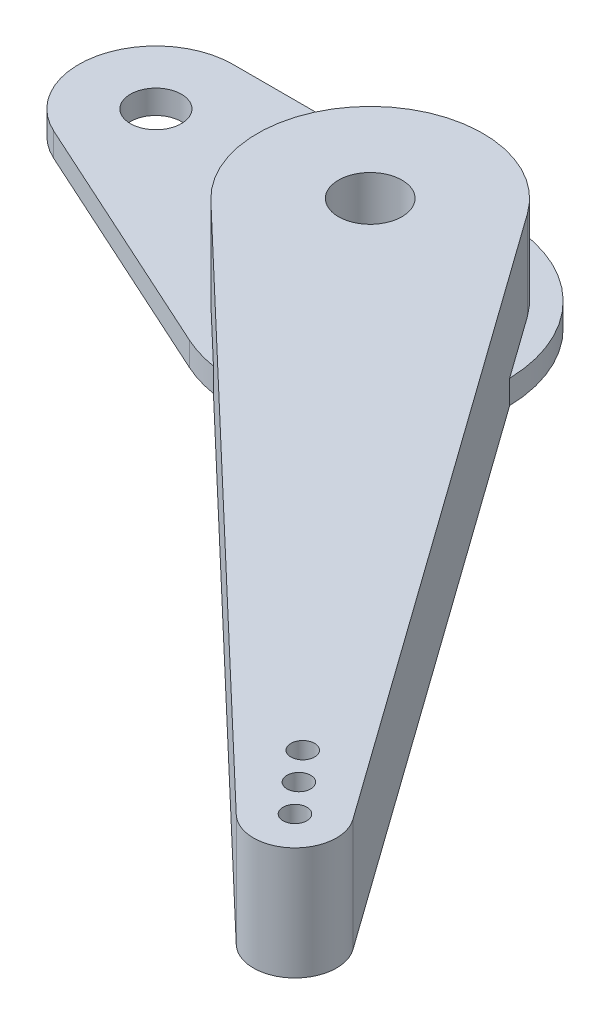
ISO-10303-21;
HEADER;
FILE_DESCRIPTION(('STEP AP214'),'2;1');
FILE_NAME('part.step','',(''),(''),'','','');
FILE_SCHEMA(('AUTOMOTIVE_DESIGN { 1 0 10303 214 1 1 1 1 }'));
ENDSEC;
DATA;
#1=APPLICATION_CONTEXT('core data for automotive mechanical design processes');
#2=APPLICATION_PROTOCOL_DEFINITION('international standard','automotive_design',2000,#1);
#3=PRODUCT_CONTEXT('',#1,'mechanical');
#4=PRODUCT('Part','Part','',(#3));
#5=PRODUCT_RELATED_PRODUCT_CATEGORY('part','',(#4));
#6=PRODUCT_DEFINITION_FORMATION('','',#4);
#7=PRODUCT_DEFINITION_CONTEXT('part definition',#1,'design');
#8=PRODUCT_DEFINITION('design','',#6,#7);
#9=PRODUCT_DEFINITION_SHAPE('','',#8);
#10=(LENGTH_UNIT() NAMED_UNIT(*) SI_UNIT(.MILLI.,.METRE.));
#11=(NAMED_UNIT(*) PLANE_ANGLE_UNIT() SI_UNIT($,.RADIAN.));
#12=(NAMED_UNIT(*) SI_UNIT($,.STERADIAN.) SOLID_ANGLE_UNIT());
#13=UNCERTAINTY_MEASURE_WITH_UNIT(LENGTH_MEASURE(1.E-05),#10,'distance_accuracy_value','');
#14=(GEOMETRIC_REPRESENTATION_CONTEXT(3) GLOBAL_UNCERTAINTY_ASSIGNED_CONTEXT((#13)) GLOBAL_UNIT_ASSIGNED_CONTEXT((#10,
#11,#12)) REPRESENTATION_CONTEXT('',''));
#15=CARTESIAN_POINT('',(0.,0.,0.));
#16=DIRECTION('',(0.,0.,1.));
#17=DIRECTION('',(1.,0.,0.));
#18=AXIS2_PLACEMENT_3D('',#15,#16,#17);
#19=CARTESIAN_POINT('',(0.,2.,0.));
#20=DIRECTION('',(0.,-1.,0.));
#21=DIRECTION('',(0.,0.,-1.));
#22=AXIS2_PLACEMENT_3D('',#19,#20,#21);
#23=CYLINDRICAL_SURFACE('',#22,11.5);
#24=CARTESIAN_POINT('',(0.,2.,0.));
#25=DIRECTION('',(0.,1.,0.));
#26=DIRECTION('',(0.,0.,1.));
#27=AXIS2_PLACEMENT_3D('',#24,#25,#26);
#28=CIRCLE('',#27,11.5);
#29=CARTESIAN_POINT('',(11.4972327717699,2.,-0.252266905754932));
#30=VERTEX_POINT('',#29);
#31=CARTESIAN_POINT('',(0.,2.,-11.5));
#32=VERTEX_POINT('',#31);
#33=EDGE_CURVE('E180',#30,#32,#28,.T.);
#34=ORIENTED_EDGE('',*,*,#33,.F.);
#35=DIRECTION('',(0.,-1.,0.));
#36=VECTOR('',#35,1.);
#37=CARTESIAN_POINT('',(11.4972327717699,2.,-0.252266905754932));
#38=LINE('',#37,#36);
#39=CARTESIAN_POINT('',(11.4972327717699,0.,-0.252266905754929));
#40=VERTEX_POINT('',#39);
#41=EDGE_CURVE('E11',#30,#40,#38,.T.);
#42=ORIENTED_EDGE('',*,*,#41,.T.);
#43=CARTESIAN_POINT('',(0.,0.,0.));
#44=DIRECTION('',(0.,1.,0.));
#45=DIRECTION('',(0.,0.,1.));
#46=AXIS2_PLACEMENT_3D('',#43,#44,#45);
#47=CIRCLE('',#46,11.5);
#48=CARTESIAN_POINT('',(0.,0.,-11.5));
#49=VERTEX_POINT('',#48);
#50=EDGE_CURVE('E176',#40,#49,#47,.T.);
#51=ORIENTED_EDGE('',*,*,#50,.T.);
#52=DIRECTION('',(0.,-1.,0.));
#53=VECTOR('',#52,1.);
#54=CARTESIAN_POINT('',(0.,2.,-11.5));
#55=LINE('',#54,#53);
#56=EDGE_CURVE('E203',#32,#49,#55,.T.);
#57=ORIENTED_EDGE('',*,*,#56,.F.);
#58=EDGE_LOOP('',(#34,#42,#51,#57));
#59=FACE_BOUND('',#58,.T.);
#60=ADVANCED_FACE('F33',(#59),#23,.T.);
#61=CARTESIAN_POINT('',(0.,2.,0.));
#62=DIRECTION('',(0.,1.,0.));
#63=DIRECTION('',(0.,0.,1.));
#64=AXIS2_PLACEMENT_3D('',#61,#62,#63);
#65=PLANE('',#64);
#66=DIRECTION('',(-0.581528317185255,0.,-0.813526162032719));
#67=VECTOR('',#66,1.);
#68=CARTESIAN_POINT('',(7.72849853931083,2.,-5.52451901325992));
#69=LINE('',#68,#67);
#70=CARTESIAN_POINT('',(7.72849853931083,2.,-5.52451901325992));
#71=VERTEX_POINT('',#70);
#72=EDGE_CURVE('E164',#30,#71,#69,.T.);
#73=ORIENTED_EDGE('',*,*,#72,.F.);
#74=ORIENTED_EDGE('',*,*,#33,.T.);
#75=DIRECTION('',(-1.,0.,0.));
#76=VECTOR('',#75,1.);
#77=CARTESIAN_POINT('',(0.,2.,-11.5));
#78=LINE('',#77,#76);
#79=CARTESIAN_POINT('',(-23.0642580630724,2.,-11.5));
#80=VERTEX_POINT('',#79);
#81=EDGE_CURVE('E179',#32,#80,#78,.T.);
#82=ORIENTED_EDGE('',*,*,#81,.T.);
#83=CARTESIAN_POINT('',(-23.0642580630724,2.,-5.));
#84=DIRECTION('',(0.,1.,0.));
#85=DIRECTION('',(0.,0.,1.));
#86=AXIS2_PLACEMENT_3D('',#83,#84,#85);
#87=CIRCLE('',#86,6.5);
#88=CARTESIAN_POINT('',(-25.7559716046188,2.,0.916475150818731));
#89=VERTEX_POINT('',#88);
#90=EDGE_CURVE('E182',#80,#89,#87,.T.);
#91=ORIENTED_EDGE('',*,*,#90,.T.);
#92=DIRECTION('',(0.910226946279805,0.,0.414109775622529));
#93=VECTOR('',#92,1.);
#94=CARTESIAN_POINT('',(-25.7559716046188,2.,0.91647515081873));
#95=LINE('',#94,#93);
#96=CARTESIAN_POINT('',(-4.76226241965909,2.,10.4676098822178));
#97=VERTEX_POINT('',#96);
#98=EDGE_CURVE('E184',#89,#97,#95,.T.);
#99=ORIENTED_EDGE('',*,*,#98,.T.);
#100=CARTESIAN_POINT('',(-1.86448246155958,2.,11.347850243572));
#101=VERTEX_POINT('',#100);
#102=EDGE_CURVE('E177',#97,#101,#28,.T.);
#103=ORIENTED_EDGE('',*,*,#102,.T.);
#104=DIRECTION('',(0.72379092585132,0.,0.690019344406582));
#105=VECTOR('',#104,1.);
#106=CARTESIAN_POINT('',(-6.55518377186253,2.,6.87601379558754));
#107=LINE('',#106,#105);
#108=CARTESIAN_POINT('',(-6.55518377186253,2.,6.87601379558754));
#109=VERTEX_POINT('',#108);
#110=EDGE_CURVE('E53',#109,#101,#107,.T.);
#111=ORIENTED_EDGE('',*,*,#110,.F.);
#112=CARTESIAN_POINT('',(0.,2.,0.));
#113=DIRECTION('',(0.,1.,0.));
#114=DIRECTION('',(0.,0.,1.));
#115=AXIS2_PLACEMENT_3D('',#112,#113,#114);
#116=CIRCLE('',#115,9.5);
#117=EDGE_CURVE('E48',#71,#109,#116,.T.);
#118=ORIENTED_EDGE('',*,*,#117,.F.);
#119=EDGE_LOOP('',(#73,#74,#82,#91,#99,#103,#111,#118));
#120=FACE_BOUND('',#119,.T.);
#121=CARTESIAN_POINT('',(-23.0642580630724,2.,-5.));
#122=DIRECTION('',(0.,1.,0.));
#123=DIRECTION('',(0.,0.,1.));
#124=AXIS2_PLACEMENT_3D('',#121,#122,#123);
#125=CIRCLE('',#124,2.15);
#126=CARTESIAN_POINT('',(-23.0642580630724,2.,-2.85));
#127=VERTEX_POINT('',#126);
#128=EDGE_CURVE('E168',#127,#127,#125,.T.);
#129=ORIENTED_EDGE('',*,*,#128,.F.);
#130=EDGE_LOOP('',(#129));
#131=FACE_BOUND('',#130,.T.);
#132=ADVANCED_FACE('F210',(#120,#131),#65,.T.);
#133=CARTESIAN_POINT('',(0.,0.,0.));
#134=DIRECTION('',(0.,1.,0.));
#135=DIRECTION('',(0.,0.,1.));
#136=AXIS2_PLACEMENT_3D('',#133,#134,#135);
#137=PLANE('',#136);
#138=ORIENTED_EDGE('',*,*,#50,.F.);
#139=DIRECTION('',(-0.581528317185255,0.,-0.813526162032719));
#140=VECTOR('',#139,1.);
#141=CARTESIAN_POINT('',(7.72849853931083,0.,-5.52451901325992));
#142=LINE('',#141,#140);
#143=CARTESIAN_POINT('',(44.6048483983303,0.,46.0634681647178));
#144=VERTEX_POINT('',#143);
#145=EDGE_CURVE('E117',#144,#40,#142,.T.);
#146=ORIENTED_EDGE('',*,*,#145,.F.);
#147=CARTESIAN_POINT('',(41.7575068312158,0.,48.0988172748662));
#148=DIRECTION('',(0.,1.,0.));
#149=DIRECTION('',(0.,0.,1.));
#150=AXIS2_PLACEMENT_3D('',#147,#148,#149);
#151=CIRCLE('',#150,3.50000000000001);
#152=CARTESIAN_POINT('',(39.3424391257927,0.,50.6320855153458));
#153=VERTEX_POINT('',#152);
#154=EDGE_CURVE('E153',#153,#144,#151,.T.);
#155=ORIENTED_EDGE('',*,*,#154,.F.);
#156=DIRECTION('',(0.72379092585132,0.,0.690019344406582));
#157=VECTOR('',#156,1.);
#158=CARTESIAN_POINT('',(-6.55518377186253,0.,6.87601379558754));
#159=LINE('',#158,#157);
#160=CARTESIAN_POINT('',(-1.86448246155958,0.,11.347850243572));
#161=VERTEX_POINT('',#160);
#162=EDGE_CURVE('E151',#161,#153,#159,.T.);
#163=ORIENTED_EDGE('',*,*,#162,.F.);
#164=CARTESIAN_POINT('',(-4.76226241965909,0.,10.4676098822178));
#165=VERTEX_POINT('',#164);
#166=EDGE_CURVE('E187',#165,#161,#47,.T.);
#167=ORIENTED_EDGE('',*,*,#166,.F.);
#168=DIRECTION('',(0.910226946279805,0.,0.414109775622529));
#169=VECTOR('',#168,1.);
#170=CARTESIAN_POINT('',(-25.7559716046188,0.,0.91647515081873));
#171=LINE('',#170,#169);
#172=CARTESIAN_POINT('',(-25.7559716046188,0.,0.916475150818731));
#173=VERTEX_POINT('',#172);
#174=EDGE_CURVE('E193',#173,#165,#171,.T.);
#175=ORIENTED_EDGE('',*,*,#174,.F.);
#176=CARTESIAN_POINT('',(-23.0642580630724,0.,-5.));
#177=DIRECTION('',(0.,1.,0.));
#178=DIRECTION('',(0.,0.,1.));
#179=AXIS2_PLACEMENT_3D('',#176,#177,#178);
#180=CIRCLE('',#179,6.5);
#181=CARTESIAN_POINT('',(-23.0642580630724,0.,-11.5));
#182=VERTEX_POINT('',#181);
#183=EDGE_CURVE('E191',#182,#173,#180,.T.);
#184=ORIENTED_EDGE('',*,*,#183,.F.);
#185=DIRECTION('',(-1.,0.,0.));
#186=VECTOR('',#185,1.);
#187=CARTESIAN_POINT('',(0.,0.,-11.5));
#188=LINE('',#187,#186);
#189=EDGE_CURVE('E189',#49,#182,#188,.T.);
#190=ORIENTED_EDGE('',*,*,#189,.F.);
#191=EDGE_LOOP('',(#138,#146,#155,#163,#167,#175,#184,#190));
#192=FACE_BOUND('',#191,.T.);
#193=CARTESIAN_POINT('',(-23.0642580630724,0.,-5.));
#194=DIRECTION('',(0.,1.,0.));
#195=DIRECTION('',(0.,0.,1.));
#196=AXIS2_PLACEMENT_3D('',#193,#194,#195);
#197=CIRCLE('',#196,2.15);
#198=CARTESIAN_POINT('',(-23.0642580630724,0.,-2.85));
#199=VERTEX_POINT('',#198);
#200=EDGE_CURVE('E167',#199,#199,#197,.T.);
#201=ORIENTED_EDGE('',*,*,#200,.T.);
#202=EDGE_LOOP('',(#201));
#203=FACE_BOUND('',#202,.T.);
#204=CARTESIAN_POINT('',(0.,0.,0.));
#205=DIRECTION('',(0.,1.,0.));
#206=DIRECTION('',(0.,0.,1.));
#207=AXIS2_PLACEMENT_3D('',#204,#205,#206);
#208=CIRCLE('',#207,2.675);
#209=CARTESIAN_POINT('',(0.,0.,2.675));
#210=VERTEX_POINT('',#209);
#211=EDGE_CURVE('E171',#210,#210,#208,.T.);
#212=ORIENTED_EDGE('',*,*,#211,.T.);
#213=EDGE_LOOP('',(#212));
#214=FACE_BOUND('',#213,.T.);
#215=CARTESIAN_POINT('',(41.7575068312158,0.,48.0988172748662));
#216=DIRECTION('',(0.,1.,0.));
#217=DIRECTION('',(0.,0.,1.));
#218=AXIS2_PLACEMENT_3D('',#215,#216,#217);
#219=CIRCLE('',#218,0.999999999999998);
#220=CARTESIAN_POINT('',(41.7575068312158,0.,49.0988172748662));
#221=VERTEX_POINT('',#220);
#222=EDGE_CURVE('E148',#221,#221,#219,.T.);
#223=ORIENTED_EDGE('',*,*,#222,.T.);
#224=EDGE_LOOP('',(#223));
#225=FACE_BOUND('',#224,.T.);
#226=CARTESIAN_POINT('',(39.5941106288275,0.,45.6068869244166));
#227=DIRECTION('',(0.,1.,0.));
#228=DIRECTION('',(0.,0.,1.));
#229=AXIS2_PLACEMENT_3D('',#226,#227,#228);
#230=CIRCLE('',#229,0.999999999999998);
#231=CARTESIAN_POINT('',(39.5941106288275,0.,46.6068869244166));
#232=VERTEX_POINT('',#231);
#233=EDGE_CURVE('E145',#232,#232,#230,.T.);
#234=ORIENTED_EDGE('',*,*,#233,.T.);
#235=EDGE_LOOP('',(#234));
#236=FACE_BOUND('',#235,.T.);
#237=CARTESIAN_POINT('',(37.4307144264392,0.,43.114956573967));
#238=DIRECTION('',(0.,1.,0.));
#239=DIRECTION('',(0.,0.,1.));
#240=AXIS2_PLACEMENT_3D('',#237,#238,#239);
#241=CIRCLE('',#240,0.999999999999998);
#242=CARTESIAN_POINT('',(37.4307144264392,0.,44.114956573967));
#243=VERTEX_POINT('',#242);
#244=EDGE_CURVE('E142',#243,#243,#241,.T.);
#245=ORIENTED_EDGE('',*,*,#244,.T.);
#246=EDGE_LOOP('',(#245));
#247=FACE_BOUND('',#246,.T.);
#248=ADVANCED_FACE('F220',(#192,#203,#214,#225,#236,#247),#137,.F.);
#249=ORIENTED_EDGE('',*,*,#166,.T.);
#250=DIRECTION('',(0.,-1.,0.));
#251=VECTOR('',#250,1.);
#252=CARTESIAN_POINT('',(-1.86448246155958,2.,11.347850243572));
#253=LINE('',#252,#251);
#254=EDGE_CURVE('E41',#161,#101,#253,.F.);
#255=ORIENTED_EDGE('',*,*,#254,.T.);
#256=ORIENTED_EDGE('',*,*,#102,.F.);
#257=DIRECTION('',(0.,-1.,0.));
#258=VECTOR('',#257,1.);
#259=CARTESIAN_POINT('',(-4.76226241965909,2.,10.4676098822178));
#260=LINE('',#259,#258);
#261=EDGE_CURVE('E186',#97,#165,#260,.T.);
#262=ORIENTED_EDGE('',*,*,#261,.T.);
#263=EDGE_LOOP('',(#249,#255,#256,#262));
#264=FACE_BOUND('',#263,.T.);
#265=ADVANCED_FACE('F35',(#264),#23,.T.);
#266=CARTESIAN_POINT('',(0.,2.,-11.5));
#267=DIRECTION('',(0.,0.,1.));
#268=DIRECTION('',(1.,0.,0.));
#269=AXIS2_PLACEMENT_3D('',#266,#267,#268);
#270=PLANE('',#269);
#271=ORIENTED_EDGE('',*,*,#189,.T.);
#272=DIRECTION('',(0.,-1.,0.));
#273=VECTOR('',#272,1.);
#274=CARTESIAN_POINT('',(-23.0642580630724,2.,-11.5));
#275=LINE('',#274,#273);
#276=EDGE_CURVE('E200',#80,#182,#275,.T.);
#277=ORIENTED_EDGE('',*,*,#276,.F.);
#278=ORIENTED_EDGE('',*,*,#81,.F.);
#279=ORIENTED_EDGE('',*,*,#56,.T.);
#280=EDGE_LOOP('',(#271,#277,#278,#279));
#281=FACE_BOUND('',#280,.T.);
#282=ADVANCED_FACE('F236',(#281),#270,.F.);
#283=CARTESIAN_POINT('',(-23.0642580630724,2.,-5.));
#284=DIRECTION('',(0.,-1.,0.));
#285=DIRECTION('',(0.,0.,-1.));
#286=AXIS2_PLACEMENT_3D('',#283,#284,#285);
#287=CYLINDRICAL_SURFACE('',#286,6.5);
#288=ORIENTED_EDGE('',*,*,#183,.T.);
#289=DIRECTION('',(0.,-1.,0.));
#290=VECTOR('',#289,1.);
#291=CARTESIAN_POINT('',(-25.7559716046188,2.,0.916475150818731));
#292=LINE('',#291,#290);
#293=EDGE_CURVE('E197',#89,#173,#292,.T.);
#294=ORIENTED_EDGE('',*,*,#293,.F.);
#295=ORIENTED_EDGE('',*,*,#90,.F.);
#296=ORIENTED_EDGE('',*,*,#276,.T.);
#297=EDGE_LOOP('',(#288,#294,#295,#296));
#298=FACE_BOUND('',#297,.T.);
#299=ADVANCED_FACE('F239',(#298),#287,.T.);
#300=CARTESIAN_POINT('',(-25.7559716046188,2.,0.91647515081873));
#301=DIRECTION('',(0.414109775622529,0.,-0.910226946279805));
#302=DIRECTION('',(-0.910226946279805,0.,-0.414109775622529));
#303=AXIS2_PLACEMENT_3D('',#300,#301,#302);
#304=PLANE('',#303);
#305=ORIENTED_EDGE('',*,*,#174,.T.);
#306=ORIENTED_EDGE('',*,*,#261,.F.);
#307=ORIENTED_EDGE('',*,*,#98,.F.);
#308=ORIENTED_EDGE('',*,*,#293,.T.);
#309=EDGE_LOOP('',(#305,#306,#307,#308));
#310=FACE_BOUND('',#309,.T.);
#311=ADVANCED_FACE('F217',(#310),#304,.F.);
#312=CARTESIAN_POINT('',(0.,2.,0.));
#313=DIRECTION('',(0.,-1.,0.));
#314=DIRECTION('',(0.,0.,-1.));
#315=AXIS2_PLACEMENT_3D('',#312,#313,#314);
#316=CYLINDRICAL_SURFACE('',#315,2.675);
#317=ORIENTED_EDGE('',*,*,#211,.F.);
#318=EDGE_LOOP('',(#317));
#319=FACE_BOUND('',#318,.T.);
#320=CARTESIAN_POINT('',(0.,9.5,0.));
#321=DIRECTION('',(0.,1.,0.));
#322=DIRECTION('',(0.,0.,1.));
#323=AXIS2_PLACEMENT_3D('',#320,#321,#322);
#324=CIRCLE('',#323,2.675);
#325=CARTESIAN_POINT('',(0.,9.5,2.675));
#326=VERTEX_POINT('',#325);
#327=EDGE_CURVE('E133',#326,#326,#324,.T.);
#328=ORIENTED_EDGE('',*,*,#327,.T.);
#329=EDGE_LOOP('',(#328));
#330=FACE_BOUND('',#329,.T.);
#331=ADVANCED_FACE('F246',(#319,#330),#316,.F.);
#332=CARTESIAN_POINT('',(-23.0642580630724,2.,-5.));
#333=DIRECTION('',(0.,-1.,0.));
#334=DIRECTION('',(0.,0.,-1.));
#335=AXIS2_PLACEMENT_3D('',#332,#333,#334);
#336=CYLINDRICAL_SURFACE('',#335,2.15);
#337=ORIENTED_EDGE('',*,*,#128,.T.);
#338=EDGE_LOOP('',(#337));
#339=FACE_BOUND('',#338,.T.);
#340=ORIENTED_EDGE('',*,*,#200,.F.);
#341=EDGE_LOOP('',(#340));
#342=FACE_BOUND('',#341,.T.);
#343=ADVANCED_FACE('F263',(#339,#342),#336,.F.);
#344=CARTESIAN_POINT('',(0.,0.,0.));
#345=DIRECTION('',(0.,1.,0.));
#346=DIRECTION('',(0.,0.,1.));
#347=AXIS2_PLACEMENT_3D('',#344,#345,#346);
#348=CYLINDRICAL_SURFACE('',#347,9.5);
#349=DIRECTION('',(0.,1.,0.));
#350=VECTOR('',#349,1.);
#351=CARTESIAN_POINT('',(7.72849853931083,0.,-5.52451901325992));
#352=LINE('',#351,#350);
#353=CARTESIAN_POINT('',(7.72849853931083,9.5,-5.52451901325992));
#354=VERTEX_POINT('',#353);
#355=EDGE_CURVE('E158',#71,#354,#352,.T.);
#356=ORIENTED_EDGE('',*,*,#355,.F.);
#357=ORIENTED_EDGE('',*,*,#117,.T.);
#358=DIRECTION('',(0.,1.,0.));
#359=VECTOR('',#358,1.);
#360=CARTESIAN_POINT('',(-6.55518377186253,0.,6.87601379558754));
#361=LINE('',#360,#359);
#362=CARTESIAN_POINT('',(-6.55518377186253,9.5,6.87601379558754));
#363=VERTEX_POINT('',#362);
#364=EDGE_CURVE('E109',#109,#363,#361,.T.);
#365=ORIENTED_EDGE('',*,*,#364,.T.);
#366=CARTESIAN_POINT('',(0.,9.5,0.));
#367=DIRECTION('',(0.,1.,0.));
#368=DIRECTION('',(0.,0.,1.));
#369=AXIS2_PLACEMENT_3D('',#366,#367,#368);
#370=CIRCLE('',#369,9.5);
#371=EDGE_CURVE('E114',#354,#363,#370,.T.);
#372=ORIENTED_EDGE('',*,*,#371,.F.);
#373=EDGE_LOOP('',(#356,#357,#365,#372));
#374=FACE_BOUND('',#373,.T.);
#375=ADVANCED_FACE('F112',(#374),#348,.T.);
#376=CARTESIAN_POINT('',(7.72849853931083,0.,-5.52451901325992));
#377=DIRECTION('',(0.813526162032719,0.,-0.581528317185255));
#378=DIRECTION('',(-0.581528317185255,0.,-0.813526162032719));
#379=AXIS2_PLACEMENT_3D('',#376,#377,#378);
#380=PLANE('',#379);
#381=ORIENTED_EDGE('',*,*,#41,.F.);
#382=ORIENTED_EDGE('',*,*,#72,.T.);
#383=ORIENTED_EDGE('',*,*,#355,.T.);
#384=DIRECTION('',(-0.581528317185255,0.,-0.813526162032719));
#385=VECTOR('',#384,1.);
#386=CARTESIAN_POINT('',(7.72849853931083,9.5,-5.52451901325992));
#387=LINE('',#386,#385);
#388=CARTESIAN_POINT('',(44.6048483983303,9.5,46.0634681647178));
#389=VERTEX_POINT('',#388);
#390=EDGE_CURVE('E132',#389,#354,#387,.T.);
#391=ORIENTED_EDGE('',*,*,#390,.F.);
#392=DIRECTION('',(0.,1.,0.));
#393=VECTOR('',#392,1.);
#394=CARTESIAN_POINT('',(44.6048483983303,0.,46.0634681647178));
#395=LINE('',#394,#393);
#396=EDGE_CURVE('E160',#144,#389,#395,.T.);
#397=ORIENTED_EDGE('',*,*,#396,.F.);
#398=ORIENTED_EDGE('',*,*,#145,.T.);
#399=EDGE_LOOP('',(#381,#382,#383,#391,#397,#398));
#400=FACE_BOUND('',#399,.T.);
#401=ADVANCED_FACE('F229',(#400),#380,.T.);
#402=CARTESIAN_POINT('',(41.7575068312158,0.,48.0988172748662));
#403=DIRECTION('',(0.,1.,0.));
#404=DIRECTION('',(0.,0.,1.));
#405=AXIS2_PLACEMENT_3D('',#402,#403,#404);
#406=CYLINDRICAL_SURFACE('',#405,3.50000000000001);
#407=ORIENTED_EDGE('',*,*,#396,.T.);
#408=CARTESIAN_POINT('',(41.7575068312158,9.5,48.0988172748662));
#409=DIRECTION('',(0.,1.,0.));
#410=DIRECTION('',(0.,0.,1.));
#411=AXIS2_PLACEMENT_3D('',#408,#409,#410);
#412=CIRCLE('',#411,3.50000000000001);
#413=CARTESIAN_POINT('',(39.3424391257927,9.5,50.6320855153458));
#414=VERTEX_POINT('',#413);
#415=EDGE_CURVE('E126',#414,#389,#412,.T.);
#416=ORIENTED_EDGE('',*,*,#415,.F.);
#417=DIRECTION('',(0.,1.,0.));
#418=VECTOR('',#417,1.);
#419=CARTESIAN_POINT('',(39.3424391257927,0.,50.6320855153458));
#420=LINE('',#419,#418);
#421=EDGE_CURVE('E116',#153,#414,#420,.T.);
#422=ORIENTED_EDGE('',*,*,#421,.F.);
#423=ORIENTED_EDGE('',*,*,#154,.T.);
#424=EDGE_LOOP('',(#407,#416,#422,#423));
#425=FACE_BOUND('',#424,.T.);
#426=ADVANCED_FACE('F226',(#425),#406,.T.);
#427=CARTESIAN_POINT('',(-6.55518377186253,0.,6.87601379558754));
#428=DIRECTION('',(-0.690019344406582,0.,0.72379092585132));
#429=DIRECTION('',(0.72379092585132,0.,0.690019344406582));
#430=AXIS2_PLACEMENT_3D('',#427,#428,#429);
#431=PLANE('',#430);
#432=ORIENTED_EDGE('',*,*,#364,.F.);
#433=ORIENTED_EDGE('',*,*,#110,.T.);
#434=ORIENTED_EDGE('',*,*,#254,.F.);
#435=ORIENTED_EDGE('',*,*,#162,.T.);
#436=ORIENTED_EDGE('',*,*,#421,.T.);
#437=DIRECTION('',(0.72379092585132,0.,0.690019344406582));
#438=VECTOR('',#437,1.);
#439=CARTESIAN_POINT('',(-6.55518377186253,9.5,6.87601379558754));
#440=LINE('',#439,#438);
#441=EDGE_CURVE('E120',#363,#414,#440,.T.);
#442=ORIENTED_EDGE('',*,*,#441,.F.);
#443=EDGE_LOOP('',(#432,#433,#434,#435,#436,#442));
#444=FACE_BOUND('',#443,.T.);
#445=ADVANCED_FACE('F121',(#444),#431,.T.);
#446=CARTESIAN_POINT('',(41.7575068312158,0.,48.0988172748662));
#447=DIRECTION('',(0.,1.,0.));
#448=DIRECTION('',(0.,0.,1.));
#449=AXIS2_PLACEMENT_3D('',#446,#447,#448);
#450=CYLINDRICAL_SURFACE('',#449,0.999999999999998);
#451=ORIENTED_EDGE('',*,*,#222,.F.);
#452=EDGE_LOOP('',(#451));
#453=FACE_BOUND('',#452,.T.);
#454=CARTESIAN_POINT('',(41.7575068312158,9.5,48.0988172748662));
#455=DIRECTION('',(0.,1.,0.));
#456=DIRECTION('',(0.,0.,1.));
#457=AXIS2_PLACEMENT_3D('',#454,#455,#456);
#458=CIRCLE('',#457,0.999999999999998);
#459=CARTESIAN_POINT('',(41.7575068312158,9.5,49.0988172748662));
#460=VERTEX_POINT('',#459);
#461=EDGE_CURVE('E136',#460,#460,#458,.T.);
#462=ORIENTED_EDGE('',*,*,#461,.T.);
#463=EDGE_LOOP('',(#462));
#464=FACE_BOUND('',#463,.T.);
#465=ADVANCED_FACE('F272',(#453,#464),#450,.F.);
#466=CARTESIAN_POINT('',(39.5941106288275,0.,45.6068869244166));
#467=DIRECTION('',(0.,1.,0.));
#468=DIRECTION('',(0.,0.,1.));
#469=AXIS2_PLACEMENT_3D('',#466,#467,#468);
#470=CYLINDRICAL_SURFACE('',#469,0.999999999999998);
#471=ORIENTED_EDGE('',*,*,#233,.F.);
#472=EDGE_LOOP('',(#471));
#473=FACE_BOUND('',#472,.T.);
#474=CARTESIAN_POINT('',(39.5941106288275,9.5,45.6068869244166));
#475=DIRECTION('',(0.,1.,0.));
#476=DIRECTION('',(0.,0.,1.));
#477=AXIS2_PLACEMENT_3D('',#474,#475,#476);
#478=CIRCLE('',#477,0.999999999999998);
#479=CARTESIAN_POINT('',(39.5941106288275,9.5,46.6068869244166));
#480=VERTEX_POINT('',#479);
#481=EDGE_CURVE('E295',#480,#480,#478,.T.);
#482=ORIENTED_EDGE('',*,*,#481,.T.);
#483=EDGE_LOOP('',(#482));
#484=FACE_BOUND('',#483,.T.);
#485=ADVANCED_FACE('F279',(#473,#484),#470,.F.);
#486=CARTESIAN_POINT('',(37.4307144264392,0.,43.114956573967));
#487=DIRECTION('',(0.,1.,0.));
#488=DIRECTION('',(0.,0.,1.));
#489=AXIS2_PLACEMENT_3D('',#486,#487,#488);
#490=CYLINDRICAL_SURFACE('',#489,0.999999999999998);
#491=ORIENTED_EDGE('',*,*,#244,.F.);
#492=EDGE_LOOP('',(#491));
#493=FACE_BOUND('',#492,.T.);
#494=CARTESIAN_POINT('',(37.4307144264392,9.5,43.114956573967));
#495=DIRECTION('',(0.,1.,0.));
#496=DIRECTION('',(0.,0.,1.));
#497=AXIS2_PLACEMENT_3D('',#494,#495,#496);
#498=CIRCLE('',#497,0.999999999999998);
#499=CARTESIAN_POINT('',(37.4307144264392,9.5,44.114956573967));
#500=VERTEX_POINT('',#499);
#501=EDGE_CURVE('E299',#500,#500,#498,.T.);
#502=ORIENTED_EDGE('',*,*,#501,.T.);
#503=EDGE_LOOP('',(#502));
#504=FACE_BOUND('',#503,.T.);
#505=ADVANCED_FACE('F283',(#493,#504),#490,.F.);
#506=CARTESIAN_POINT('',(0.,9.5,0.));
#507=DIRECTION('',(0.,1.,0.));
#508=DIRECTION('',(0.,0.,1.));
#509=AXIS2_PLACEMENT_3D('',#506,#507,#508);
#510=PLANE('',#509);
#511=ORIENTED_EDGE('',*,*,#481,.F.);
#512=EDGE_LOOP('',(#511));
#513=FACE_BOUND('',#512,.T.);
#514=ORIENTED_EDGE('',*,*,#327,.F.);
#515=EDGE_LOOP('',(#514));
#516=FACE_BOUND('',#515,.T.);
#517=ORIENTED_EDGE('',*,*,#371,.T.);
#518=ORIENTED_EDGE('',*,*,#441,.T.);
#519=ORIENTED_EDGE('',*,*,#415,.T.);
#520=ORIENTED_EDGE('',*,*,#390,.T.);
#521=EDGE_LOOP('',(#517,#518,#519,#520));
#522=FACE_BOUND('',#521,.T.);
#523=ORIENTED_EDGE('',*,*,#461,.F.);
#524=EDGE_LOOP('',(#523));
#525=FACE_BOUND('',#524,.T.);
#526=ORIENTED_EDGE('',*,*,#501,.F.);
#527=EDGE_LOOP('',(#526));
#528=FACE_BOUND('',#527,.T.);
#529=ADVANCED_FACE('F129',(#513,#516,#522,#525,#528),#510,.T.);
#530=CLOSED_SHELL('',(#60,#132,#248,#265,#282,#299,#311,#331,#343,#375,#401,#426,#445,#465,#485,
#505,#529));
#531=MANIFOLD_SOLID_BREP('B2',#530);
#532=ADVANCED_BREP_SHAPE_REPRESENTATION('',(#18,#531),#14);
#533=SHAPE_DEFINITION_REPRESENTATION(#9,#532);
ENDSEC;
END-ISO-10303-21;
